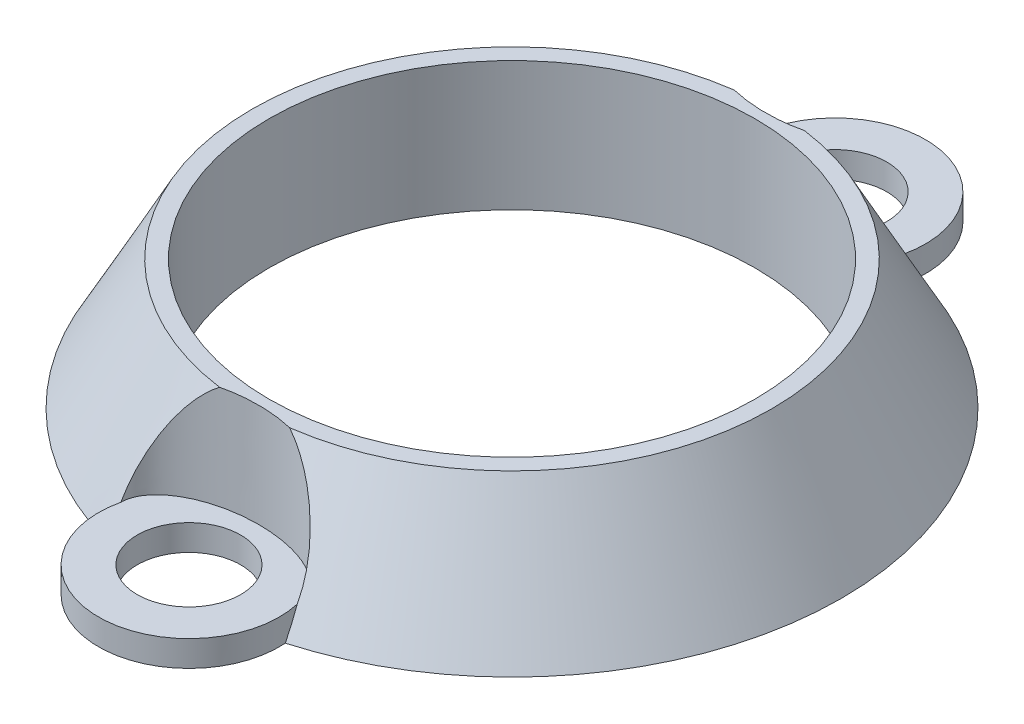
ISO-10303-21;
HEADER;
FILE_DESCRIPTION(('STEP AP214'),'2;1');
FILE_NAME('part.step','',(''),(''),'','','');
FILE_SCHEMA(('AUTOMOTIVE_DESIGN { 1 0 10303 214 1 1 1 1 }'));
ENDSEC;
DATA;
#1=APPLICATION_CONTEXT('core data for automotive mechanical design processes');
#2=APPLICATION_PROTOCOL_DEFINITION('international standard','automotive_design',2000,#1);
#3=PRODUCT_CONTEXT('',#1,'mechanical');
#4=PRODUCT('Part','Part','',(#3));
#5=PRODUCT_RELATED_PRODUCT_CATEGORY('part','',(#4));
#6=PRODUCT_DEFINITION_FORMATION('','',#4);
#7=PRODUCT_DEFINITION_CONTEXT('part definition',#1,'design');
#8=PRODUCT_DEFINITION('design','',#6,#7);
#9=PRODUCT_DEFINITION_SHAPE('','',#8);
#10=(LENGTH_UNIT() NAMED_UNIT(*) SI_UNIT(.MILLI.,.METRE.));
#11=(NAMED_UNIT(*) PLANE_ANGLE_UNIT() SI_UNIT($,.RADIAN.));
#12=(NAMED_UNIT(*) SI_UNIT($,.STERADIAN.) SOLID_ANGLE_UNIT());
#13=UNCERTAINTY_MEASURE_WITH_UNIT(LENGTH_MEASURE(1.E-05),#10,'distance_accuracy_value','');
#14=(GEOMETRIC_REPRESENTATION_CONTEXT(3) GLOBAL_UNCERTAINTY_ASSIGNED_CONTEXT((#13)) GLOBAL_UNIT_ASSIGNED_CONTEXT((#10,
#11,#12)) REPRESENTATION_CONTEXT('',''));
#15=CARTESIAN_POINT('',(0.,0.,0.));
#16=DIRECTION('',(0.,0.,1.));
#17=DIRECTION('',(1.,0.,0.));
#18=AXIS2_PLACEMENT_3D('',#15,#16,#17);
#19=CARTESIAN_POINT('',(0.,0.,0.));
#20=DIRECTION('',(0.,-1.,0.));
#21=DIRECTION('',(0.,0.,-1.));
#22=AXIS2_PLACEMENT_3D('',#19,#20,#21);
#23=CONICAL_SURFACE('',#22,12.75,0.495133263468404);
#24=CARTESIAN_POINT('',(0.,5.,0.));
#25=DIRECTION('',(0.,1.,0.));
#26=DIRECTION('',(0.,0.,1.));
#27=AXIS2_PLACEMENT_3D('',#24,#25,#26);
#28=CIRCLE('',#27,10.05);
#29=CARTESIAN_POINT('',(1.3553625375493,5.,9.95818720409533));
#30=VERTEX_POINT('',#29);
#31=CARTESIAN_POINT('',(1.35536253754929,5.,-9.95818720409533));
#32=VERTEX_POINT('',#31);
#33=EDGE_CURVE('E100',#30,#32,#28,.T.);
#34=ORIENTED_EDGE('',*,*,#33,.F.);
#35=CARTESIAN_POINT('',(1.3553625375493,5.,9.95818720409533));
#36=CARTESIAN_POINT('',(1.40057138130981,4.96847390125947,9.96921409885815));
#37=CARTESIAN_POINT('',(1.44489190629856,4.93585530203897,9.98067681119035));
#38=CARTESIAN_POINT('',(1.53178371674484,4.86868172968102,10.0044089567286));
#39=CARTESIAN_POINT('',(1.57435581542542,4.83412767484797,10.0166780078267));
#40=CARTESIAN_POINT('',(1.69936923847219,4.72804469045643,10.054557914301));
#41=CARTESIAN_POINT('',(1.77930625432241,4.65395409699024,10.0812905931941));
#42=CARTESIAN_POINT('',(1.95705564719147,4.47626555929464,10.1462127954255));
#43=CARTESIAN_POINT('',(2.05256404915375,4.37072600527725,10.1853581833675));
#44=CARTESIAN_POINT('',(2.23360946019535,4.15273857328969,10.2676875871247));
#45=CARTESIAN_POINT('',(2.31913449933577,4.04028264428019,10.3108763413762));
#46=CARTESIAN_POINT('',(2.48052580412582,3.81050225782833,10.4008439970848));
#47=CARTESIAN_POINT('',(2.55641585436712,3.6931907759146,10.4476135822217));
#48=CARTESIAN_POINT('',(2.6991563215571,3.45459652490971,10.5446944040358));
#49=CARTESIAN_POINT('',(2.76600561271462,3.33331326356827,10.5950060806044));
#50=CARTESIAN_POINT('',(2.89070246365052,3.0877427665327,10.6990876349702));
#51=CARTESIAN_POINT('',(2.94855487590872,2.96345719222637,10.7528556263258));
#52=CARTESIAN_POINT('',(3.0551168227933,2.71251616918538,10.8638971775125));
#53=CARTESIAN_POINT('',(3.10382464581947,2.58586028166607,10.9211713909511));
#54=CARTESIAN_POINT('',(3.18860125992263,2.33956202922429,11.0352263675986));
#55=CARTESIAN_POINT('',(3.2253057717721,2.22003094686075,11.0917740330146));
#56=CARTESIAN_POINT('',(3.28969569112805,1.98009809709854,11.207942157054));
#57=CARTESIAN_POINT('',(3.31738534800027,1.85969676735038,11.2675611525382));
#58=CARTESIAN_POINT('',(3.36341296155842,1.61579694918203,11.3913022391585));
#59=CARTESIAN_POINT('',(3.3815226666137,1.49229057938213,11.4554961156773));
#60=CARTESIAN_POINT('',(3.40002199535071,1.30734048251002,11.5541621796777));
#61=CARTESIAN_POINT('',(3.40474453234387,1.24569315778036,11.5874741629432));
#62=CARTESIAN_POINT('',(3.41110570881563,1.12263545828451,11.6548577789393));
#63=CARTESIAN_POINT('',(3.41274353343506,1.06122515040297,11.6889296099873));
#64=CARTESIAN_POINT('',(3.41274618503984,1.,11.723364));
#65=B_SPLINE_CURVE_WITH_KNOTS('',3,(#35,#36,#37,#38,#39,#40,#41,#42,#43,#44,#45,#46,#47,#48,#49,
#50,#51,#52,#53,#54,#55,#56,#57,#58,#59,#60,#61,#62,#63,#64),.UNSPECIFIED.,.F.,.F.,(4,2,2,2,2,2,
2,2,2,2,2,2,2,2,4),(0.,0.168578275413313,0.337077233061176,0.673333081954309,1.11554019116665,
1.55827217104295,1.99988906122293,2.44156089275472,2.88299367552588,3.32450899943841,
3.73589157128468,4.14707994648782,4.56766815434803,4.77829730601534,4.98898208978554),.UNSPECIFIED.);
#66=CARTESIAN_POINT('',(3.41274618503984,1.,11.723364));
#67=VERTEX_POINT('',#66);
#68=EDGE_CURVE('E171',#30,#67,#65,.T.);
#69=ORIENTED_EDGE('',*,*,#68,.T.);
#70=CARTESIAN_POINT('',(3.41272217615235,1.0002,11.7232585060666));
#71=CARTESIAN_POINT('',(3.42275042707584,0.916660419959649,11.7673228006305));
#72=CARTESIAN_POINT('',(3.431935817764,0.833142292217373,11.8116201944721));
#73=CARTESIAN_POINT('',(3.44859839187013,0.666205494436472,11.9006496360383));
#74=CARTESIAN_POINT('',(3.45607617638121,0.582786799714477,11.9453815250181));
#75=CARTESIAN_POINT('',(3.46930816295085,0.416046311206313,12.0352795948325));
#76=CARTESIAN_POINT('',(3.4750623615512,0.332724517614902,12.0804457765383));
#77=CARTESIAN_POINT('',(3.48482145586493,0.166176350441456,12.171211222315));
#78=CARTESIAN_POINT('',(3.4888257339107,0.0829500208766596,12.2168106335092));
#79=CARTESIAN_POINT('',(3.49194015757519,-0.000200000000021983,12.2626101604666));
#80=B_SPLINE_CURVE_WITH_KNOTS('',3,(#70,#71,#72,#73,#74,#75,#76,#77,#78,#79),.UNSPECIFIED.,.F.,
.F.,(4,2,2,2,4),(0.,0.284934613202631,0.569768771656001,0.854603501599514,1.13953868831363),.UNSPECIFIED.);
#81=CARTESIAN_POINT('',(3.49193266687661,0.,12.2625));
#82=VERTEX_POINT('',#81);
#83=EDGE_CURVE('E105',#67,#82,#80,.T.);
#84=ORIENTED_EDGE('',*,*,#83,.T.);
#85=CARTESIAN_POINT('',(0.,0.,0.));
#86=DIRECTION('',(0.,1.,0.));
#87=DIRECTION('',(0.,0.,1.));
#88=AXIS2_PLACEMENT_3D('',#85,#86,#87);
#89=CIRCLE('',#88,12.75);
#90=CARTESIAN_POINT('',(3.49193266687661,0.,-12.2625));
#91=VERTEX_POINT('',#90);
#92=EDGE_CURVE('E11',#82,#91,#89,.T.);
#93=ORIENTED_EDGE('',*,*,#92,.T.);
#94=CARTESIAN_POINT('',(3.4919401575752,-0.000200000000021575,-12.2626101604666));
#95=CARTESIAN_POINT('',(3.48882573391071,0.0829500208766598,-12.2168106335092));
#96=CARTESIAN_POINT('',(3.48482145586494,0.166176350441456,-12.171211222315));
#97=CARTESIAN_POINT('',(3.4750623615512,0.332724517614904,-12.0804457765383));
#98=CARTESIAN_POINT('',(3.46930816295085,0.416046311206315,-12.0352795948325));
#99=CARTESIAN_POINT('',(3.45607617638121,0.582786799714478,-11.9453815250181));
#100=CARTESIAN_POINT('',(3.44859839187014,0.666205494436473,-11.9006496360383));
#101=CARTESIAN_POINT('',(3.431935817764,0.833142292217373,-11.8116201944721));
#102=CARTESIAN_POINT('',(3.42275042707585,0.916660419959648,-11.7673228006305));
#103=CARTESIAN_POINT('',(3.41272217615235,1.0002,-11.7232585060666));
#104=B_SPLINE_CURVE_WITH_KNOTS('',3,(#94,#95,#96,#97,#98,#99,#100,#101,#102,#103),.UNSPECIFIED.,
.F.,.F.,(4,2,2,2,4),(0.,0.284935186714112,0.569769916657623,0.854604075110995,1.13953868831363),.UNSPECIFIED.);
#105=CARTESIAN_POINT('',(3.41274618503984,1.,-11.723364));
#106=VERTEX_POINT('',#105);
#107=EDGE_CURVE('E141',#91,#106,#104,.T.);
#108=ORIENTED_EDGE('',*,*,#107,.T.);
#109=CARTESIAN_POINT('',(3.41274618503984,1.,-11.723364));
#110=CARTESIAN_POINT('',(3.4127384043889,1.07894733560328,-11.6789615288182));
#111=CARTESIAN_POINT('',(3.4100186793467,1.15819643891741,-11.6351664129232));
#112=CARTESIAN_POINT('',(3.39953838658001,1.31702111321574,-11.5488579885458));
#113=CARTESIAN_POINT('',(3.39177984774696,1.39659653999564,-11.5063441713518));
#114=CARTESIAN_POINT('',(3.36418660607505,1.61441599401028,-11.3918510319834));
#115=CARTESIAN_POINT('',(3.33966706371199,1.75277399576887,-11.3211922467964));
#116=CARTESIAN_POINT('',(3.27817566724755,2.02879138317387,-11.1839137531374));
#117=CARTESIAN_POINT('',(3.24119463804034,2.1664501779836,-11.1172970635387));
#118=CARTESIAN_POINT('',(3.15597851184271,2.43994889837134,-10.9882085854939));
#119=CARTESIAN_POINT('',(3.10775923997765,2.57579110016979,-10.9257311258186));
#120=CARTESIAN_POINT('',(3.00077431771157,2.84502685322925,-10.8047827953321));
#121=CARTESIAN_POINT('',(2.9420113736806,2.97842102319326,-10.746310901674));
#122=CARTESIAN_POINT('',(2.81425835576493,3.24198748793647,-10.6333132243717));
#123=CARTESIAN_POINT('',(2.74526599521864,3.37215905473004,-10.5787883270966));
#124=CARTESIAN_POINT('',(2.59705414594507,3.62821927655128,-10.4737445567573));
#125=CARTESIAN_POINT('',(2.51783644578401,3.75410867574038,-10.4232249855898));
#126=CARTESIAN_POINT('',(2.36169494886253,3.98146780064117,-10.3337403935484));
#127=CARTESIAN_POINT('',(2.28626650086794,4.08373198043235,-10.2941887046249));
#128=CARTESIAN_POINT('',(2.12743480690546,4.28298767559766,-10.2183041714331));
#129=CARTESIAN_POINT('',(2.0440393590655,4.37998420398928,-10.1819682453486));
#130=CARTESIAN_POINT('',(1.86597117609239,4.57007425542669,-10.1117600454382));
#131=CARTESIAN_POINT('',(1.77103616202908,4.66296491057223,-10.0779936576986));
#132=CARTESIAN_POINT('',(1.62110512467724,4.79521397307427,-10.0305372255822));
#133=CARTESIAN_POINT('',(1.56978477181046,4.83817917404319,-10.0152285809503));
#134=CARTESIAN_POINT('',(1.46454227328349,4.92130505476876,-9.98579249719803));
#135=CARTESIAN_POINT('',(1.41061837693257,4.96146380170131,-9.97166587084598));
#136=CARTESIAN_POINT('',(1.35536253754929,5.,-9.95818720409533));
#137=B_SPLINE_CURVE_WITH_KNOTS('',3,(#109,#110,#111,#112,#113,#114,#115,#116,#117,#118,#119,
#120,#121,#122,#123,#124,#125,#126,#127,#128,#129,#130,#131,#132,#133,#134,#135,#136),
.UNSPECIFIED.,.F.,.F.,(4,2,2,2,2,2,2,2,2,2,2,2,2,4),(0.,0.271633212596196,0.543157119127703,
1.01433866111744,1.48586788401266,1.95673709271877,2.42748561026502,2.89833951700904,
3.36911117562167,3.76802856277184,4.16655941251541,4.57698382204836,4.78285898787119,
4.98887457180873),.UNSPECIFIED.);
#138=EDGE_CURVE('E92',#106,#32,#137,.T.);
#139=ORIENTED_EDGE('',*,*,#138,.T.);
#140=EDGE_LOOP('',(#34,#69,#84,#93,#108,#139));
#141=FACE_BOUND('',#140,.T.);
#142=ADVANCED_FACE('F33',(#141),#23,.T.);
#143=CARTESIAN_POINT('',(0.,5.,0.));
#144=DIRECTION('',(0.,-1.,0.));
#145=DIRECTION('',(0.,0.,-1.));
#146=AXIS2_PLACEMENT_3D('',#143,#144,#145);
#147=PLANE('',#146);
#148=CARTESIAN_POINT('',(0.,5.,0.));
#149=DIRECTION('',(0.,1.,0.));
#150=DIRECTION('',(0.,0.,1.));
#151=AXIS2_PLACEMENT_3D('',#148,#149,#150);
#152=CIRCLE('',#151,9.4);
#153=CARTESIAN_POINT('',(0.,5.,9.4));
#154=VERTEX_POINT('',#153);
#155=EDGE_CURVE('E227',#154,#154,#152,.T.);
#156=ORIENTED_EDGE('',*,*,#155,.F.);
#157=EDGE_LOOP('',(#156));
#158=FACE_BOUND('',#157,.T.);
#159=CARTESIAN_POINT('',(-1.3553625375493,5.,-9.95818720409533));
#160=VERTEX_POINT('',#159);
#161=CARTESIAN_POINT('',(-1.3553625375493,5.,9.95818720409533));
#162=VERTEX_POINT('',#161);
#163=EDGE_CURVE('E98',#160,#162,#28,.T.);
#164=ORIENTED_EDGE('',*,*,#163,.T.);
#165=CARTESIAN_POINT('',(0.,5.,11.723364));
#166=DIRECTION('',(0.,1.,0.));
#167=DIRECTION('',(1.,0.,0.));
#168=AXIS2_PLACEMENT_3D('',#165,#166,#167);
#169=ELLIPSE('',#168,3.41274618503984,1.923364);
#170=EDGE_CURVE('E48',#30,#162,#169,.T.);
#171=ORIENTED_EDGE('',*,*,#170,.F.);
#172=ORIENTED_EDGE('',*,*,#33,.T.);
#173=CARTESIAN_POINT('',(0.,5.,-11.723364));
#174=DIRECTION('',(0.,1.,0.));
#175=DIRECTION('',(1.,0.,0.));
#176=AXIS2_PLACEMENT_3D('',#173,#174,#175);
#177=ELLIPSE('',#176,3.41274618503984,1.923364);
#178=EDGE_CURVE('E56',#160,#32,#177,.T.);
#179=ORIENTED_EDGE('',*,*,#178,.F.);
#180=EDGE_LOOP('',(#164,#171,#172,#179));
#181=FACE_BOUND('',#180,.T.);
#182=ADVANCED_FACE('F97',(#158,#181),#147,.F.);
#183=CARTESIAN_POINT('',(-3.4919401575752,-0.000200000000021575,12.2626101604666));
#184=CARTESIAN_POINT('',(-3.48882573391071,0.0829500208766608,12.2168106335092));
#185=CARTESIAN_POINT('',(-3.48482145586494,0.166176350441457,12.171211222315));
#186=CARTESIAN_POINT('',(-3.47506236155121,0.332724517614904,12.0804457765383));
#187=CARTESIAN_POINT('',(-3.46930816295086,0.416046311206315,12.0352795948325));
#188=CARTESIAN_POINT('',(-3.45607617638122,0.582786799714479,11.9453815250181));
#189=CARTESIAN_POINT('',(-3.44859839187014,0.666205494436474,11.9006496360383));
#190=CARTESIAN_POINT('',(-3.431935817764,0.833142292217374,11.8116201944721));
#191=CARTESIAN_POINT('',(-3.42275042707585,0.916660419959649,11.7673228006305));
#192=CARTESIAN_POINT('',(-3.41272217615236,1.0002,11.7232585060666));
#193=B_SPLINE_CURVE_WITH_KNOTS('',3,(#183,#184,#185,#186,#187,#188,#189,#190,#191,#192),
.UNSPECIFIED.,.F.,.F.,(4,2,2,2,4),(0.,0.284935186714111,0.569769916657625,0.854604075110995,
1.13953868831363),.UNSPECIFIED.);
#194=CARTESIAN_POINT('',(-3.49193266687662,0.,12.2625));
#195=VERTEX_POINT('',#194);
#196=CARTESIAN_POINT('',(-3.41274618503985,1.,11.7233640000001));
#197=VERTEX_POINT('',#196);
#198=EDGE_CURVE('E107',#195,#197,#193,.T.);
#199=ORIENTED_EDGE('',*,*,#198,.T.);
#200=CARTESIAN_POINT('',(-3.41274618503985,1.,11.723364));
#201=CARTESIAN_POINT('',(-3.41274359450641,1.06087163008068,11.6891284416467));
#202=CARTESIAN_POINT('',(-3.4111245918003,1.12192645925964,11.6552511658185));
#203=CARTESIAN_POINT('',(-3.40483553373759,1.24427076356011,11.5882479719648));
#204=CARTESIAN_POINT('',(-3.40016630295142,1.30556017081773,11.5551218533818));
#205=CARTESIAN_POINT('',(-3.38187278555667,1.48944738771743,11.4569935856283));
#206=CARTESIAN_POINT('',(-3.36396156104941,1.61224825224456,11.3931382449518));
#207=CARTESIAN_POINT('',(-3.31794029565279,1.85737537165091,11.268704526449));
#208=CARTESIAN_POINT('',(-3.28984127074481,1.97970199547168,11.2081226900035));
#209=CARTESIAN_POINT('',(-3.22434832170935,2.22345040804641,11.0901298263186));
#210=CARTESIAN_POINT('',(-3.18695032730322,2.34487177652331,11.0327202010821));
#211=CARTESIAN_POINT('',(-3.10356740081832,2.58606329340425,10.9211275817808));
#212=CARTESIAN_POINT('',(-3.05759120044733,2.70583498904585,10.8669413799309));
#213=CARTESIAN_POINT('',(-2.95741941720972,2.94334535992914,10.7616767184046));
#214=CARTESIAN_POINT('',(-2.90322086103649,3.06108328250827,10.7105993923367));
#215=CARTESIAN_POINT('',(-2.78679186153266,3.2938858493744,10.6115570607784));
#216=CARTESIAN_POINT('',(-2.7245605977105,3.40895021915575,10.563592373978));
#217=CARTESIAN_POINT('',(-2.59205296582925,3.63562055445968,10.4708336015727));
#218=CARTESIAN_POINT('',(-2.52177983788373,3.74722788997145,10.426038250714));
#219=CARTESIAN_POINT('',(-2.37511006899179,3.96284597899719,10.3409853667526));
#220=CARTESIAN_POINT('',(-2.29895577116184,4.06698375868666,10.3006328509125));
#221=CARTESIAN_POINT('',(-2.13842078974144,4.26992105183103,10.2232238007934));
#222=CARTESIAN_POINT('',(-2.0540475236597,4.36872525585429,10.1861643512889));
#223=CARTESIAN_POINT('',(-1.91948597709661,4.51320101901415,10.1327490063326));
#224=CARTESIAN_POINT('',(-1.87254196337747,4.5614210441332,10.1150619320452));
#225=CARTESIAN_POINT('',(-1.77620472917446,4.65572508514444,10.0807185537142));
#226=CARTESIAN_POINT('',(-1.72681199772307,4.70180952400532,10.0640620453384));
#227=CARTESIAN_POINT('',(-1.62532197430536,4.79164355487686,10.0318116609249));
#228=CARTESIAN_POINT('',(-1.57321696376301,4.83538567394623,10.016221146572));
#229=CARTESIAN_POINT('',(-1.46631953627807,4.91997976914196,9.98625859787161));
#230=CARTESIAN_POINT('',(-1.41152526259729,4.96082969950961,9.9718874246143));
#231=CARTESIAN_POINT('',(-1.35536253754931,5.,9.95818720409533));
#232=B_SPLINE_CURVE_WITH_KNOTS('',3,(#200,#201,#202,#203,#204,#205,#206,#207,#208,#209,#210,
#211,#212,#213,#214,#215,#216,#217,#218,#219,#220,#221,#222,#223,#224,#225,#226,#227,#228,#229,
#230,#231),.UNSPECIFIED.,.F.,.F.,(4,2,2,2,2,2,2,2,2,2,2,2,2,2,2,4),(0.,0.209468998165681,
0.418881393840621,0.837075196751253,1.25481815230681,1.67274428221266,2.09024730559206,
2.50790166473973,2.9255987185144,3.34312806834643,3.74831818119692,4.15314594484587,
4.36182537578959,4.57046329801924,4.77973141817232,4.98914611286895),.UNSPECIFIED.);
#233=EDGE_CURVE('E91',#197,#162,#232,.T.);
#234=ORIENTED_EDGE('',*,*,#233,.T.);
#235=ORIENTED_EDGE('',*,*,#163,.F.);
#236=CARTESIAN_POINT('',(-1.3553625375493,5.,-9.95818720409533));
#237=CARTESIAN_POINT('',(-1.40057331133641,4.96847267191532,-9.96921455269307));
#238=CARTESIAN_POINT('',(-1.44489486634616,4.93585319264623,-9.98067756415735));
#239=CARTESIAN_POINT('',(-1.53179124221854,4.86867573292711,-10.004411067625));
#240=CARTESIAN_POINT('',(-1.57436677261544,4.83411855369241,-10.016681226241));
#241=CARTESIAN_POINT('',(-1.69938002089756,4.72803518730724,-10.0545613845519));
#242=CARTESIAN_POINT('',(-1.77931651448246,4.65394670893058,-10.0812934876342));
#243=CARTESIAN_POINT('',(-1.93272662130012,4.50058339191844,-10.1373275748563));
#244=CARTESIAN_POINT('',(-2.00621066820947,4.42131730157772,-10.166625251252));
#245=CARTESIAN_POINT('',(-2.14731796357956,4.25850452676118,-10.2276104210276));
#246=CARTESIAN_POINT('',(-2.21493641211748,4.17495442391159,-10.2592998326855));
#247=CARTESIAN_POINT('',(-2.3775405753813,3.96110662442135,-10.3415611668297));
#248=CARTESIAN_POINT('',(-2.46896501262542,3.82863530890556,-10.3935430102054));
#249=CARTESIAN_POINT('',(-2.63979736813039,3.55802120446279,-10.5022103442746));
#250=CARTESIAN_POINT('',(-2.71920286535218,3.41987727997771,-10.5588967790879));
#251=CARTESIAN_POINT('',(-2.86616145241865,3.13946429724676,-10.6768164726001));
#252=CARTESIAN_POINT('',(-2.93372416139389,2.99719869725685,-10.738045983172));
#253=CARTESIAN_POINT('',(-3.0568240960867,2.70955870409734,-10.8650971511251));
#254=CARTESIAN_POINT('',(-3.11236289059221,2.56418471920867,-10.9309182079531));
#255=CARTESIAN_POINT('',(-3.20034377683441,2.30207382685247,-11.0528994632285));
#256=CARTESIAN_POINT('',(-3.2351869218399,2.18573319817096,-11.1081862479485));
#257=CARTESIAN_POINT('',(-3.29627871278354,1.95227454205163,-11.2216664567215));
#258=CARTESIAN_POINT('',(-3.32253161925474,1.83515692947547,-11.2798584233234));
#259=CARTESIAN_POINT('',(-3.36612390721466,1.59809077116538,-11.4004720750589));
#260=CARTESIAN_POINT('',(-3.38325661264778,1.47813614401182,-11.4629582935094));
#261=CARTESIAN_POINT('',(-3.40655382985419,1.23856737813229,-11.5909482349442));
#262=CARTESIAN_POINT('',(-3.41270251525204,1.11895397823901,-11.656456172701));
#263=CARTESIAN_POINT('',(-3.41274618503985,0.999999999999999,-11.723364));
#264=B_SPLINE_CURVE_WITH_KNOTS('',3,(#236,#237,#238,#239,#240,#241,#242,#243,#244,#245,#246,
#247,#248,#249,#250,#251,#252,#253,#254,#255,#256,#257,#258,#259,#260,#261,#262,#263),
.UNSPECIFIED.,.F.,.F.,(4,2,2,2,2,2,2,2,2,2,2,2,2,4),(0.,0.168583367158823,0.33709753394517,
0.673333094876066,1.00901454233602,1.34496814230983,1.85169958614835,2.35853296814438,
2.86495275513059,3.37130642848287,3.77134032145948,4.17117550631324,4.57972251778238,
4.9888577127321),.UNSPECIFIED.);
#265=CARTESIAN_POINT('',(-3.41274618503985,1.,-11.723364));
#266=VERTEX_POINT('',#265);
#267=EDGE_CURVE('E83',#160,#266,#264,.T.);
#268=ORIENTED_EDGE('',*,*,#267,.T.);
#269=CARTESIAN_POINT('',(-3.41272217615235,1.0002,-11.7232585060666));
#270=CARTESIAN_POINT('',(-3.42275042707585,0.916660419959649,-11.7673228006305));
#271=CARTESIAN_POINT('',(-3.431935817764,0.833142292217374,-11.8116201944721));
#272=CARTESIAN_POINT('',(-3.44859839187014,0.666205494436473,-11.9006496360383));
#273=CARTESIAN_POINT('',(-3.45607617638121,0.582786799714478,-11.9453815250181));
#274=CARTESIAN_POINT('',(-3.46930816295085,0.416046311206314,-12.0352795948325));
#275=CARTESIAN_POINT('',(-3.4750623615512,0.332724517614902,-12.0804457765383));
#276=CARTESIAN_POINT('',(-3.48482145586494,0.166176350441455,-12.171211222315));
#277=CARTESIAN_POINT('',(-3.48882573391071,0.0829500208766592,-12.2168106335092));
#278=CARTESIAN_POINT('',(-3.4919401575752,-0.000200000000021406,-12.2626101604666));
#279=B_SPLINE_CURVE_WITH_KNOTS('',3,(#269,#270,#271,#272,#273,#274,#275,#276,#277,#278),
.UNSPECIFIED.,.F.,.F.,(4,2,2,2,4),(0.,0.284934613202631,0.569768771656001,0.854603501599514,
1.13953868831363),.UNSPECIFIED.);
#280=CARTESIAN_POINT('',(-3.49193266687661,0.,-12.2625));
#281=VERTEX_POINT('',#280);
#282=EDGE_CURVE('E148',#266,#281,#279,.T.);
#283=ORIENTED_EDGE('',*,*,#282,.T.);
#284=EDGE_CURVE('E41',#281,#195,#89,.T.);
#285=ORIENTED_EDGE('',*,*,#284,.T.);
#286=EDGE_LOOP('',(#199,#234,#235,#268,#283,#285));
#287=FACE_BOUND('',#286,.T.);
#288=ADVANCED_FACE('F104',(#287),#23,.T.);
#289=CARTESIAN_POINT('',(0.,0.,0.));
#290=DIRECTION('',(0.,-1.,0.));
#291=DIRECTION('',(0.,0.,-1.));
#292=AXIS2_PLACEMENT_3D('',#289,#290,#291);
#293=PLANE('',#292);
#294=CARTESIAN_POINT('',(0.,0.,0.));
#295=DIRECTION('',(0.,1.,0.));
#296=DIRECTION('',(0.,0.,1.));
#297=AXIS2_PLACEMENT_3D('',#294,#295,#296);
#298=CIRCLE('',#297,9.4);
#299=CARTESIAN_POINT('',(0.,0.,9.4));
#300=VERTEX_POINT('',#299);
#301=EDGE_CURVE('E219',#300,#300,#298,.T.);
#302=ORIENTED_EDGE('',*,*,#301,.T.);
#303=EDGE_LOOP('',(#302));
#304=FACE_BOUND('',#303,.T.);
#305=CARTESIAN_POINT('',(0.,0.,-12.5));
#306=DIRECTION('',(0.,1.,0.));
#307=DIRECTION('',(0.,0.,1.));
#308=AXIS2_PLACEMENT_3D('',#305,#306,#307);
#309=CIRCLE('',#308,2.);
#310=CARTESIAN_POINT('',(0.,0.,-10.5));
#311=VERTEX_POINT('',#310);
#312=EDGE_CURVE('E101',#311,#311,#309,.T.);
#313=ORIENTED_EDGE('',*,*,#312,.T.);
#314=EDGE_LOOP('',(#313));
#315=FACE_BOUND('',#314,.T.);
#316=CARTESIAN_POINT('',(0.,0.,12.5));
#317=DIRECTION('',(0.,1.,0.));
#318=DIRECTION('',(0.,0.,1.));
#319=AXIS2_PLACEMENT_3D('',#316,#317,#318);
#320=CIRCLE('',#319,2.);
#321=CARTESIAN_POINT('',(0.,0.,14.5));
#322=VERTEX_POINT('',#321);
#323=EDGE_CURVE('E218',#322,#322,#320,.T.);
#324=ORIENTED_EDGE('',*,*,#323,.T.);
#325=EDGE_LOOP('',(#324));
#326=FACE_BOUND('',#325,.T.);
#327=ORIENTED_EDGE('',*,*,#284,.F.);
#328=CARTESIAN_POINT('',(0.,0.,-12.5));
#329=DIRECTION('',(0.,-1.,0.));
#330=DIRECTION('',(0.,0.,-1.));
#331=AXIS2_PLACEMENT_3D('',#328,#329,#330);
#332=CIRCLE('',#331,3.5);
#333=EDGE_CURVE('E168',#281,#91,#332,.T.);
#334=ORIENTED_EDGE('',*,*,#333,.T.);
#335=ORIENTED_EDGE('',*,*,#92,.F.);
#336=CARTESIAN_POINT('',(0.,0.,12.5));
#337=DIRECTION('',(0.,-1.,0.));
#338=DIRECTION('',(0.,0.,-1.));
#339=AXIS2_PLACEMENT_3D('',#336,#337,#338);
#340=CIRCLE('',#339,3.5);
#341=EDGE_CURVE('E154',#82,#195,#340,.T.);
#342=ORIENTED_EDGE('',*,*,#341,.T.);
#343=EDGE_LOOP('',(#327,#334,#335,#342));
#344=FACE_BOUND('',#343,.T.);
#345=ADVANCED_FACE('F35',(#304,#315,#326,#344),#293,.T.);
#346=CARTESIAN_POINT('',(0.,1.,12.5));
#347=DIRECTION('',(0.,-1.,0.));
#348=DIRECTION('',(0.,0.,-1.));
#349=AXIS2_PLACEMENT_3D('',#346,#347,#348);
#350=CYLINDRICAL_SURFACE('',#349,3.5);
#351=ORIENTED_EDGE('',*,*,#83,.F.);
#352=CARTESIAN_POINT('',(0.,1.,12.5));
#353=DIRECTION('',(0.,-1.,0.));
#354=DIRECTION('',(0.,0.,-1.));
#355=AXIS2_PLACEMENT_3D('',#352,#353,#354);
#356=CIRCLE('',#355,3.5);
#357=EDGE_CURVE('E155',#67,#197,#356,.T.);
#358=ORIENTED_EDGE('',*,*,#357,.T.);
#359=ORIENTED_EDGE('',*,*,#198,.F.);
#360=ORIENTED_EDGE('',*,*,#341,.F.);
#361=EDGE_LOOP('',(#351,#358,#359,#360));
#362=FACE_BOUND('',#361,.T.);
#363=ADVANCED_FACE('F122',(#362),#350,.T.);
#364=CARTESIAN_POINT('',(0.,1.,12.5));
#365=DIRECTION('',(0.,-1.,0.));
#366=DIRECTION('',(0.,0.,-1.));
#367=AXIS2_PLACEMENT_3D('',#364,#365,#366);
#368=PLANE('',#367);
#369=CARTESIAN_POINT('',(0.,1.,12.5));
#370=DIRECTION('',(0.,1.,0.));
#371=DIRECTION('',(0.,0.,1.));
#372=AXIS2_PLACEMENT_3D('',#369,#370,#371);
#373=CIRCLE('',#372,2.);
#374=CARTESIAN_POINT('',(0.,1.,14.5));
#375=VERTEX_POINT('',#374);
#376=EDGE_CURVE('E215',#375,#375,#373,.T.);
#377=ORIENTED_EDGE('',*,*,#376,.F.);
#378=EDGE_LOOP('',(#377));
#379=FACE_BOUND('',#378,.T.);
#380=ORIENTED_EDGE('',*,*,#357,.F.);
#381=CARTESIAN_POINT('',(0.,1.,11.723364));
#382=DIRECTION('',(0.,1.,0.));
#383=DIRECTION('',(1.,0.,0.));
#384=AXIS2_PLACEMENT_3D('',#381,#382,#383);
#385=ELLIPSE('',#384,3.41274618503984,1.923364);
#386=EDGE_CURVE('E198',#67,#197,#385,.T.);
#387=ORIENTED_EDGE('',*,*,#386,.T.);
#388=EDGE_LOOP('',(#380,#387));
#389=FACE_BOUND('',#388,.T.);
#390=ADVANCED_FACE('F126',(#379,#389),#368,.F.);
#391=CARTESIAN_POINT('',(0.,1.,-12.5));
#392=DIRECTION('',(0.,-1.,0.));
#393=DIRECTION('',(0.,0.,-1.));
#394=AXIS2_PLACEMENT_3D('',#391,#392,#393);
#395=CYLINDRICAL_SURFACE('',#394,3.5);
#396=ORIENTED_EDGE('',*,*,#282,.F.);
#397=CARTESIAN_POINT('',(0.,1.,-12.5));
#398=DIRECTION('',(0.,-1.,0.));
#399=DIRECTION('',(0.,0.,-1.));
#400=AXIS2_PLACEMENT_3D('',#397,#398,#399);
#401=CIRCLE('',#400,3.5);
#402=EDGE_CURVE('E170',#266,#106,#401,.T.);
#403=ORIENTED_EDGE('',*,*,#402,.T.);
#404=ORIENTED_EDGE('',*,*,#107,.F.);
#405=ORIENTED_EDGE('',*,*,#333,.F.);
#406=EDGE_LOOP('',(#396,#403,#404,#405));
#407=FACE_BOUND('',#406,.T.);
#408=ADVANCED_FACE('F131',(#407),#395,.T.);
#409=CARTESIAN_POINT('',(0.,1.,-12.5));
#410=DIRECTION('',(0.,-1.,0.));
#411=DIRECTION('',(0.,0.,-1.));
#412=AXIS2_PLACEMENT_3D('',#409,#410,#411);
#413=PLANE('',#412);
#414=CARTESIAN_POINT('',(0.,1.,-12.5));
#415=DIRECTION('',(0.,1.,0.));
#416=DIRECTION('',(0.,0.,1.));
#417=AXIS2_PLACEMENT_3D('',#414,#415,#416);
#418=CIRCLE('',#417,2.);
#419=CARTESIAN_POINT('',(0.,1.,-10.5));
#420=VERTEX_POINT('',#419);
#421=EDGE_CURVE('E222',#420,#420,#418,.T.);
#422=ORIENTED_EDGE('',*,*,#421,.F.);
#423=EDGE_LOOP('',(#422));
#424=FACE_BOUND('',#423,.T.);
#425=ORIENTED_EDGE('',*,*,#402,.F.);
#426=CARTESIAN_POINT('',(0.,1.,-11.723364));
#427=DIRECTION('',(0.,1.,0.));
#428=DIRECTION('',(1.,0.,0.));
#429=AXIS2_PLACEMENT_3D('',#426,#427,#428);
#430=ELLIPSE('',#429,3.41274618503984,1.923364);
#431=EDGE_CURVE('E86',#266,#106,#430,.T.);
#432=ORIENTED_EDGE('',*,*,#431,.T.);
#433=EDGE_LOOP('',(#425,#432));
#434=FACE_BOUND('',#433,.T.);
#435=ADVANCED_FACE('F136',(#424,#434),#413,.F.);
#436=CARTESIAN_POINT('',(0.,-6.83483646287528,-11.723364));
#437=DIRECTION('',(0.,1.,0.));
#438=DIRECTION('',(1.,0.,0.));
#439=AXIS2_PLACEMENT_3D('',#436,#437,#438);
#440=ELLIPSE('',#439,3.41274618503984,1.923364);
#441=DIRECTION('',(0.,1.,0.));
#442=VECTOR('',#441,1.);
#443=SURFACE_OF_LINEAR_EXTRUSION('',#440,#442);
#444=ORIENTED_EDGE('',*,*,#178,.T.);
#445=ORIENTED_EDGE('',*,*,#138,.F.);
#446=ORIENTED_EDGE('',*,*,#431,.F.);
#447=ORIENTED_EDGE('',*,*,#267,.F.);
#448=EDGE_LOOP('',(#444,#445,#446,#447));
#449=FACE_BOUND('',#448,.T.);
#450=ADVANCED_FACE('F84',(#449),#443,.F.);
#451=CARTESIAN_POINT('',(0.,-6.83483646287528,11.723364));
#452=DIRECTION('',(0.,1.,0.));
#453=DIRECTION('',(1.,0.,0.));
#454=AXIS2_PLACEMENT_3D('',#451,#452,#453);
#455=ELLIPSE('',#454,3.41274618503984,1.923364);
#456=DIRECTION('',(0.,1.,0.));
#457=VECTOR('',#456,1.);
#458=SURFACE_OF_LINEAR_EXTRUSION('',#455,#457);
#459=ORIENTED_EDGE('',*,*,#170,.T.);
#460=ORIENTED_EDGE('',*,*,#233,.F.);
#461=ORIENTED_EDGE('',*,*,#386,.F.);
#462=ORIENTED_EDGE('',*,*,#68,.F.);
#463=EDGE_LOOP('',(#459,#460,#461,#462));
#464=FACE_BOUND('',#463,.T.);
#465=ADVANCED_FACE('F185',(#464),#458,.F.);
#466=CARTESIAN_POINT('',(0.,0.,-12.5));
#467=DIRECTION('',(0.,1.,0.));
#468=DIRECTION('',(0.,0.,1.));
#469=AXIS2_PLACEMENT_3D('',#466,#467,#468);
#470=CYLINDRICAL_SURFACE('',#469,2.);
#471=ORIENTED_EDGE('',*,*,#312,.F.);
#472=EDGE_LOOP('',(#471));
#473=FACE_BOUND('',#472,.T.);
#474=ORIENTED_EDGE('',*,*,#421,.T.);
#475=EDGE_LOOP('',(#474));
#476=FACE_BOUND('',#475,.T.);
#477=ADVANCED_FACE('F190',(#473,#476),#470,.F.);
#478=CARTESIAN_POINT('',(0.,0.,12.5));
#479=DIRECTION('',(0.,1.,0.));
#480=DIRECTION('',(0.,0.,1.));
#481=AXIS2_PLACEMENT_3D('',#478,#479,#480);
#482=CYLINDRICAL_SURFACE('',#481,2.);
#483=ORIENTED_EDGE('',*,*,#323,.F.);
#484=EDGE_LOOP('',(#483));
#485=FACE_BOUND('',#484,.T.);
#486=ORIENTED_EDGE('',*,*,#376,.T.);
#487=EDGE_LOOP('',(#486));
#488=FACE_BOUND('',#487,.T.);
#489=ADVANCED_FACE('F191',(#485,#488),#482,.F.);
#490=CARTESIAN_POINT('',(0.,0.,0.));
#491=DIRECTION('',(0.,1.,0.));
#492=DIRECTION('',(0.,0.,1.));
#493=AXIS2_PLACEMENT_3D('',#490,#491,#492);
#494=CYLINDRICAL_SURFACE('',#493,9.4);
#495=ORIENTED_EDGE('',*,*,#301,.F.);
#496=EDGE_LOOP('',(#495));
#497=FACE_BOUND('',#496,.T.);
#498=ORIENTED_EDGE('',*,*,#155,.T.);
#499=EDGE_LOOP('',(#498));
#500=FACE_BOUND('',#499,.T.);
#501=ADVANCED_FACE('F235',(#497,#500),#494,.F.);
#502=CLOSED_SHELL('',(#142,#182,#288,#345,#363,#390,#408,#435,#450,#465,#477,#489,#501));
#503=MANIFOLD_SOLID_BREP('B2',#502);
#504=ADVANCED_BREP_SHAPE_REPRESENTATION('',(#18,#503),#14);
#505=SHAPE_DEFINITION_REPRESENTATION(#9,#504);
ENDSEC;
END-ISO-10303-21;
